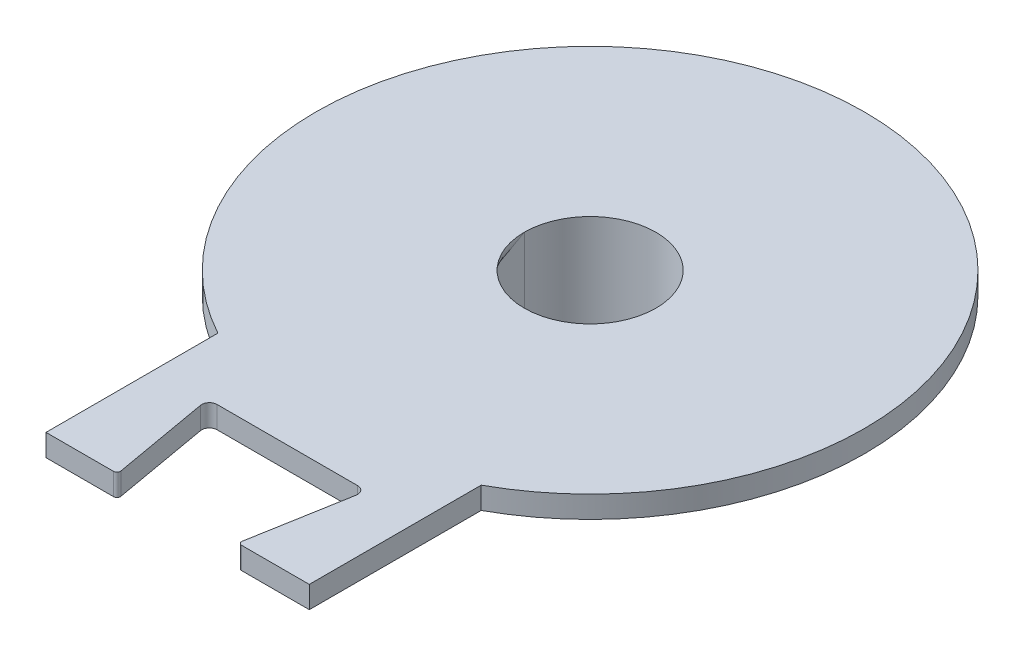
ISO-10303-21;
HEADER;
FILE_DESCRIPTION(('STEP AP214'),'2;1');
FILE_NAME('part.step','',(''),(''),'','','');
FILE_SCHEMA(('AUTOMOTIVE_DESIGN { 1 0 10303 214 1 1 1 1 }'));
ENDSEC;
DATA;
#1=APPLICATION_CONTEXT('core data for automotive mechanical design processes');
#2=APPLICATION_PROTOCOL_DEFINITION('international standard','automotive_design',2000,#1);
#3=PRODUCT_CONTEXT('',#1,'mechanical');
#4=PRODUCT('Part','Part','',(#3));
#5=PRODUCT_RELATED_PRODUCT_CATEGORY('part','',(#4));
#6=PRODUCT_DEFINITION_FORMATION('','',#4);
#7=PRODUCT_DEFINITION_CONTEXT('part definition',#1,'design');
#8=PRODUCT_DEFINITION('design','',#6,#7);
#9=PRODUCT_DEFINITION_SHAPE('','',#8);
#10=(LENGTH_UNIT() NAMED_UNIT(*) SI_UNIT(.MILLI.,.METRE.));
#11=(NAMED_UNIT(*) PLANE_ANGLE_UNIT() SI_UNIT($,.RADIAN.));
#12=(NAMED_UNIT(*) SI_UNIT($,.STERADIAN.) SOLID_ANGLE_UNIT());
#13=UNCERTAINTY_MEASURE_WITH_UNIT(LENGTH_MEASURE(1.E-05),#10,'distance_accuracy_value','');
#14=(GEOMETRIC_REPRESENTATION_CONTEXT(3) GLOBAL_UNCERTAINTY_ASSIGNED_CONTEXT((#13)) GLOBAL_UNIT_ASSIGNED_CONTEXT((#10,
#11,#12)) REPRESENTATION_CONTEXT('',''));
#15=CARTESIAN_POINT('',(0.,0.,0.));
#16=DIRECTION('',(0.,0.,1.));
#17=DIRECTION('',(1.,0.,0.));
#18=AXIS2_PLACEMENT_3D('',#15,#16,#17);
#19=CARTESIAN_POINT('',(0.,0.,0.));
#20=DIRECTION('',(0.,1.,0.));
#21=DIRECTION('',(0.,0.,1.));
#22=AXIS2_PLACEMENT_3D('',#19,#20,#21);
#23=PLANE('',#22);
#24=DIRECTION('',(-1.,0.,0.));
#25=VECTOR('',#24,1.);
#26=CARTESIAN_POINT('',(0.,0.,18.8));
#27=LINE('',#26,#25);
#28=CARTESIAN_POINT('',(6.,0.,18.8));
#29=VERTEX_POINT('',#28);
#30=CARTESIAN_POINT('',(2.91630349460621,0.,18.8));
#31=VERTEX_POINT('',#30);
#32=EDGE_CURVE('E187',#29,#31,#27,.T.);
#33=ORIENTED_EDGE('',*,*,#32,.T.);
#34=CARTESIAN_POINT('',(2.91630349460621,0.,18.65));
#35=DIRECTION('',(0.,1.,0.));
#36=DIRECTION('',(0.,0.,1.));
#37=AXIS2_PLACEMENT_3D('',#34,#35,#36);
#38=CIRCLE('',#37,0.15);
#39=CARTESIAN_POINT('',(2.76858233165438,0.,18.62395277335));
#40=VERTEX_POINT('',#39);
#41=EDGE_CURVE('E459',#31,#40,#38,.F.);
#42=ORIENTED_EDGE('',*,*,#41,.T.);
#43=DIRECTION('',(-0.173648177666934,0.,0.984807753012207));
#44=VECTOR('',#43,1.);
#45=CARTESIAN_POINT('',(2.70227505957538,0.,19.));
#46=LINE('',#45,#44);
#47=CARTESIAN_POINT('',(3.54674431540572,0.,14.2107768621834));
#48=VERTEX_POINT('',#47);
#49=EDGE_CURVE('E229',#48,#40,#46,.T.);
#50=ORIENTED_EDGE('',*,*,#49,.F.);
#51=CARTESIAN_POINT('',(3.20206160185145,0.,14.15));
#52=DIRECTION('',(0.,1.,0.));
#53=DIRECTION('',(0.,0.,1.));
#54=AXIS2_PLACEMENT_3D('',#51,#52,#53);
#55=CIRCLE('',#54,0.35);
#56=CARTESIAN_POINT('',(3.20206160185145,0.,13.8));
#57=VERTEX_POINT('',#56);
#58=EDGE_CURVE('E436',#48,#57,#55,.T.);
#59=ORIENTED_EDGE('',*,*,#58,.T.);
#60=DIRECTION('',(1.,0.,0.));
#61=VECTOR('',#60,1.);
#62=CARTESIAN_POINT('',(3.61917535925942,0.,13.8));
#63=LINE('',#62,#61);
#64=CARTESIAN_POINT('',(-3.20206160185144,0.,13.8));
#65=VERTEX_POINT('',#64);
#66=EDGE_CURVE('E226',#65,#57,#63,.T.);
#67=ORIENTED_EDGE('',*,*,#66,.F.);
#68=CARTESIAN_POINT('',(-3.20206160185145,0.,14.15));
#69=DIRECTION('',(0.,1.,0.));
#70=DIRECTION('',(0.,0.,1.));
#71=AXIS2_PLACEMENT_3D('',#68,#69,#70);
#72=CIRCLE('',#71,0.35);
#73=CARTESIAN_POINT('',(-3.54674431540572,0.,14.2107768621834));
#74=VERTEX_POINT('',#73);
#75=EDGE_CURVE('E435',#65,#74,#72,.T.);
#76=ORIENTED_EDGE('',*,*,#75,.T.);
#77=DIRECTION('',(-0.173648177666935,0.,-0.984807753012207));
#78=VECTOR('',#77,1.);
#79=CARTESIAN_POINT('',(-2.70227505957538,0.,19.));
#80=LINE('',#79,#78);
#81=CARTESIAN_POINT('',(-2.76858233165438,0.,18.62395277335));
#82=VERTEX_POINT('',#81);
#83=EDGE_CURVE('E222',#82,#74,#80,.T.);
#84=ORIENTED_EDGE('',*,*,#83,.F.);
#85=CARTESIAN_POINT('',(-2.91630349460621,0.,18.65));
#86=DIRECTION('',(0.,1.,0.));
#87=DIRECTION('',(0.,0.,1.));
#88=AXIS2_PLACEMENT_3D('',#85,#86,#87);
#89=CIRCLE('',#88,0.15);
#90=CARTESIAN_POINT('',(-2.91630349460621,0.,18.8));
#91=VERTEX_POINT('',#90);
#92=EDGE_CURVE('E58',#82,#91,#89,.F.);
#93=ORIENTED_EDGE('',*,*,#92,.T.);
#94=CARTESIAN_POINT('',(-6.,0.,18.8));
#95=VERTEX_POINT('',#94);
#96=EDGE_CURVE('E246',#91,#95,#27,.T.);
#97=ORIENTED_EDGE('',*,*,#96,.T.);
#98=DIRECTION('',(0.,0.,1.));
#99=VECTOR('',#98,1.);
#100=CARTESIAN_POINT('',(-6.,0.,13.2915026221292));
#101=LINE('',#100,#99);
#102=CARTESIAN_POINT('',(-6.,0.,10.9658560997307));
#103=VERTEX_POINT('',#102);
#104=EDGE_CURVE('E218',#103,#95,#101,.T.);
#105=ORIENTED_EDGE('',*,*,#104,.F.);
#106=CARTESIAN_POINT('',(0.,0.,0.));
#107=DIRECTION('',(0.,1.,0.));
#108=DIRECTION('',(0.,0.,1.));
#109=AXIS2_PLACEMENT_3D('',#106,#107,#108);
#110=CIRCLE('',#109,12.5);
#111=CARTESIAN_POINT('',(6.,0.,10.9658560997307));
#112=VERTEX_POINT('',#111);
#113=EDGE_CURVE('E471',#112,#103,#110,.T.);
#114=ORIENTED_EDGE('',*,*,#113,.F.);
#115=DIRECTION('',(0.,0.,-1.));
#116=VECTOR('',#115,1.);
#117=CARTESIAN_POINT('',(6.,0.,13.2915026221292));
#118=LINE('',#117,#116);
#119=EDGE_CURVE('E233',#29,#112,#118,.T.);
#120=ORIENTED_EDGE('',*,*,#119,.F.);
#121=EDGE_LOOP('',(#33,#42,#50,#59,#67,#76,#84,#93,#97,#105,#114,#120));
#122=FACE_BOUND('',#121,.T.);
#123=DIRECTION('',(0.,0.,1.));
#124=VECTOR('',#123,1.);
#125=CARTESIAN_POINT('',(-3.,0.,0.));
#126=LINE('',#125,#124);
#127=CARTESIAN_POINT('',(-3.,0.,2.64575131106459));
#128=VERTEX_POINT('',#127);
#129=CARTESIAN_POINT('',(-3.,0.,2.82842712474619));
#130=VERTEX_POINT('',#129);
#131=EDGE_CURVE('E242',#128,#130,#126,.T.);
#132=ORIENTED_EDGE('',*,*,#131,.F.);
#133=CARTESIAN_POINT('',(0.,0.,0.));
#134=DIRECTION('',(0.,1.,0.));
#135=DIRECTION('',(0.,0.,1.));
#136=AXIS2_PLACEMENT_3D('',#133,#134,#135);
#137=CIRCLE('',#136,4.);
#138=CARTESIAN_POINT('',(3.,0.,2.64575131106459));
#139=VERTEX_POINT('',#138);
#140=EDGE_CURVE('E249',#128,#139,#137,.T.);
#141=ORIENTED_EDGE('',*,*,#140,.T.);
#142=DIRECTION('',(0.,0.,-1.));
#143=VECTOR('',#142,1.);
#144=CARTESIAN_POINT('',(3.,0.,0.));
#145=LINE('',#144,#143);
#146=CARTESIAN_POINT('',(3.,0.,2.82842712474619));
#147=VERTEX_POINT('',#146);
#148=EDGE_CURVE('E368',#147,#139,#145,.T.);
#149=ORIENTED_EDGE('',*,*,#148,.F.);
#150=CARTESIAN_POINT('',(3.5,0.,2.82842712474619));
#151=DIRECTION('',(0.,1.,0.));
#152=DIRECTION('',(0.,0.,1.));
#153=AXIS2_PLACEMENT_3D('',#150,#151,#152);
#154=CIRCLE('',#153,0.5);
#155=CARTESIAN_POINT('',(3.88888888888889,0.,3.14269680527354));
#156=VERTEX_POINT('',#155);
#157=EDGE_CURVE('E341',#147,#156,#154,.T.);
#158=ORIENTED_EDGE('',*,*,#157,.T.);
#159=CARTESIAN_POINT('',(0.,0.,0.));
#160=DIRECTION('',(0.,-1.,0.));
#161=DIRECTION('',(0.,0.,-1.));
#162=AXIS2_PLACEMENT_3D('',#159,#160,#161);
#163=CIRCLE('',#162,5.);
#164=CARTESIAN_POINT('',(-3.88888888888889,0.,3.14269680527354));
#165=VERTEX_POINT('',#164);
#166=EDGE_CURVE('E245',#165,#156,#163,.T.);
#167=ORIENTED_EDGE('',*,*,#166,.F.);
#168=CARTESIAN_POINT('',(-3.5,0.,2.82842712474619));
#169=DIRECTION('',(0.,1.,0.));
#170=DIRECTION('',(0.,0.,1.));
#171=AXIS2_PLACEMENT_3D('',#168,#169,#170);
#172=CIRCLE('',#171,0.5);
#173=EDGE_CURVE('E247',#165,#130,#172,.T.);
#174=ORIENTED_EDGE('',*,*,#173,.T.);
#175=EDGE_LOOP('',(#132,#141,#149,#158,#167,#174));
#176=FACE_BOUND('',#175,.T.);
#177=ADVANCED_FACE('F39',(#122,#176),#23,.F.);
#178=CARTESIAN_POINT('',(-6.,1.,13.2915026221292));
#179=DIRECTION('',(1.,0.,0.));
#180=DIRECTION('',(0.,0.,-1.));
#181=AXIS2_PLACEMENT_3D('',#178,#179,#180);
#182=PLANE('',#181);
#183=ORIENTED_EDGE('',*,*,#104,.T.);
#184=DIRECTION('',(0.,1.,0.));
#185=VECTOR('',#184,1.);
#186=CARTESIAN_POINT('',(-6.,-3.,18.8));
#187=LINE('',#186,#185);
#188=CARTESIAN_POINT('',(-6.,1.,18.8));
#189=VERTEX_POINT('',#188);
#190=EDGE_CURVE('E192',#95,#189,#187,.T.);
#191=ORIENTED_EDGE('',*,*,#190,.T.);
#192=DIRECTION('',(0.,0.,1.));
#193=VECTOR('',#192,1.);
#194=CARTESIAN_POINT('',(-6.,1.,-6.));
#195=LINE('',#194,#193);
#196=CARTESIAN_POINT('',(-6.,1.,10.9658560997307));
#197=VERTEX_POINT('',#196);
#198=EDGE_CURVE('E235',#197,#189,#195,.T.);
#199=ORIENTED_EDGE('',*,*,#198,.F.);
#200=DIRECTION('',(0.,-1.,0.));
#201=VECTOR('',#200,1.);
#202=CARTESIAN_POINT('',(-6.,1.,10.9658560997307));
#203=LINE('',#202,#201);
#204=EDGE_CURVE('E412',#103,#197,#203,.F.);
#205=ORIENTED_EDGE('',*,*,#204,.F.);
#206=EDGE_LOOP('',(#183,#191,#199,#205));
#207=FACE_BOUND('',#206,.T.);
#208=ADVANCED_FACE('F295',(#207),#182,.F.);
#209=CARTESIAN_POINT('',(6.,1.,13.2915026221292));
#210=DIRECTION('',(-1.,0.,0.));
#211=DIRECTION('',(0.,0.,1.));
#212=AXIS2_PLACEMENT_3D('',#209,#210,#211);
#213=PLANE('',#212);
#214=DIRECTION('',(0.,0.,-1.));
#215=VECTOR('',#214,1.);
#216=CARTESIAN_POINT('',(6.,1.,19.));
#217=LINE('',#216,#215);
#218=CARTESIAN_POINT('',(6.,1.,18.8));
#219=VERTEX_POINT('',#218);
#220=CARTESIAN_POINT('',(6.,1.,10.9658560997307));
#221=VERTEX_POINT('',#220);
#222=EDGE_CURVE('E199',#219,#221,#217,.T.);
#223=ORIENTED_EDGE('',*,*,#222,.F.);
#224=DIRECTION('',(0.,1.,0.));
#225=VECTOR('',#224,1.);
#226=CARTESIAN_POINT('',(6.,-3.,18.8));
#227=LINE('',#226,#225);
#228=EDGE_CURVE('E181',#29,#219,#227,.T.);
#229=ORIENTED_EDGE('',*,*,#228,.F.);
#230=ORIENTED_EDGE('',*,*,#119,.T.);
#231=DIRECTION('',(0.,-1.,0.));
#232=VECTOR('',#231,1.);
#233=CARTESIAN_POINT('',(6.,1.,10.9658560997307));
#234=LINE('',#233,#232);
#235=EDGE_CURVE('E207',#221,#112,#234,.T.);
#236=ORIENTED_EDGE('',*,*,#235,.F.);
#237=EDGE_LOOP('',(#223,#229,#230,#236));
#238=FACE_BOUND('',#237,.T.);
#239=ADVANCED_FACE('F205',(#238),#213,.F.);
#240=CARTESIAN_POINT('',(0.,1.,0.));
#241=DIRECTION('',(0.,1.,0.));
#242=DIRECTION('',(0.,0.,1.));
#243=AXIS2_PLACEMENT_3D('',#240,#241,#242);
#244=PLANE('',#243);
#245=DIRECTION('',(-0.173648177666934,0.,0.984807753012207));
#246=VECTOR('',#245,1.);
#247=CARTESIAN_POINT('',(2.70227505957538,1.,19.));
#248=LINE('',#247,#246);
#249=CARTESIAN_POINT('',(3.54674431540572,1.,14.2107768621834));
#250=VERTEX_POINT('',#249);
#251=CARTESIAN_POINT('',(2.76858233165438,1.,18.62395277335));
#252=VERTEX_POINT('',#251);
#253=EDGE_CURVE('E209',#250,#252,#248,.T.);
#254=ORIENTED_EDGE('',*,*,#253,.T.);
#255=CARTESIAN_POINT('',(2.91630349460621,1.,18.65));
#256=DIRECTION('',(0.,1.,0.));
#257=DIRECTION('',(0.,0.,1.));
#258=AXIS2_PLACEMENT_3D('',#255,#256,#257);
#259=CIRCLE('',#258,0.15);
#260=CARTESIAN_POINT('',(2.91630349460621,1.,18.8));
#261=VERTEX_POINT('',#260);
#262=EDGE_CURVE('E201',#252,#261,#259,.T.);
#263=ORIENTED_EDGE('',*,*,#262,.T.);
#264=DIRECTION('',(-1.,0.,0.));
#265=VECTOR('',#264,1.);
#266=CARTESIAN_POINT('',(-6.,1.,18.8));
#267=LINE('',#266,#265);
#268=EDGE_CURVE('E184',#219,#261,#267,.T.);
#269=ORIENTED_EDGE('',*,*,#268,.F.);
#270=ORIENTED_EDGE('',*,*,#222,.T.);
#271=CARTESIAN_POINT('',(0.,1.,0.));
#272=DIRECTION('',(0.,1.,0.));
#273=DIRECTION('',(0.,0.,1.));
#274=AXIS2_PLACEMENT_3D('',#271,#272,#273);
#275=CIRCLE('',#274,12.5);
#276=EDGE_CURVE('E377',#221,#197,#275,.T.);
#277=ORIENTED_EDGE('',*,*,#276,.T.);
#278=ORIENTED_EDGE('',*,*,#198,.T.);
#279=CARTESIAN_POINT('',(-2.91630349460621,1.,18.8));
#280=VERTEX_POINT('',#279);
#281=EDGE_CURVE('E203',#280,#189,#267,.T.);
#282=ORIENTED_EDGE('',*,*,#281,.F.);
#283=CARTESIAN_POINT('',(-2.91630349460621,1.,18.65));
#284=DIRECTION('',(0.,1.,0.));
#285=DIRECTION('',(0.,0.,1.));
#286=AXIS2_PLACEMENT_3D('',#283,#284,#285);
#287=CIRCLE('',#286,0.15);
#288=CARTESIAN_POINT('',(-2.76858233165438,1.,18.62395277335));
#289=VERTEX_POINT('',#288);
#290=EDGE_CURVE('E449',#280,#289,#287,.T.);
#291=ORIENTED_EDGE('',*,*,#290,.T.);
#292=DIRECTION('',(-0.173648177666935,0.,-0.984807753012207));
#293=VECTOR('',#292,1.);
#294=CARTESIAN_POINT('',(-2.70227505957538,1.,19.));
#295=LINE('',#294,#293);
#296=CARTESIAN_POINT('',(-3.54674431540572,1.,14.2107768621834));
#297=VERTEX_POINT('',#296);
#298=EDGE_CURVE('E419',#289,#297,#295,.T.);
#299=ORIENTED_EDGE('',*,*,#298,.T.);
#300=CARTESIAN_POINT('',(-3.20206160185145,1.,14.15));
#301=DIRECTION('',(0.,1.,0.));
#302=DIRECTION('',(0.,0.,1.));
#303=AXIS2_PLACEMENT_3D('',#300,#301,#302);
#304=CIRCLE('',#303,0.35);
#305=CARTESIAN_POINT('',(-3.20206160185145,1.,13.8));
#306=VERTEX_POINT('',#305);
#307=EDGE_CURVE('E427',#297,#306,#304,.F.);
#308=ORIENTED_EDGE('',*,*,#307,.T.);
#309=DIRECTION('',(1.,0.,0.));
#310=VECTOR('',#309,1.);
#311=CARTESIAN_POINT('',(-3.61917535925942,1.,13.8));
#312=LINE('',#311,#310);
#313=CARTESIAN_POINT('',(3.20206160185144,1.,13.8));
#314=VERTEX_POINT('',#313);
#315=EDGE_CURVE('E214',#306,#314,#312,.T.);
#316=ORIENTED_EDGE('',*,*,#315,.T.);
#317=CARTESIAN_POINT('',(3.20206160185145,1.,14.15));
#318=DIRECTION('',(0.,1.,0.));
#319=DIRECTION('',(0.,0.,1.));
#320=AXIS2_PLACEMENT_3D('',#317,#318,#319);
#321=CIRCLE('',#320,0.35);
#322=EDGE_CURVE('E424',#314,#250,#321,.F.);
#323=ORIENTED_EDGE('',*,*,#322,.T.);
#324=EDGE_LOOP('',(#254,#263,#269,#270,#277,#278,#282,#291,#299,#308,#316,#323));
#325=FACE_BOUND('',#324,.T.);
#326=CARTESIAN_POINT('',(0.,1.,0.));
#327=DIRECTION('',(0.,1.,0.));
#328=DIRECTION('',(0.,0.,1.));
#329=AXIS2_PLACEMENT_3D('',#326,#327,#328);
#330=CIRCLE('',#329,3.);
#331=CARTESIAN_POINT('',(3.,1.,0.));
#332=VERTEX_POINT('',#331);
#333=CARTESIAN_POINT('',(-3.,1.,0.));
#334=VERTEX_POINT('',#333);
#335=EDGE_CURVE('E223',#332,#334,#330,.T.);
#336=ORIENTED_EDGE('',*,*,#335,.F.);
#337=EDGE_CURVE('E410',#334,#332,#330,.T.);
#338=ORIENTED_EDGE('',*,*,#337,.F.);
#339=EDGE_LOOP('',(#336,#338));
#340=FACE_BOUND('',#339,.T.);
#341=ADVANCED_FACE('F196',(#325,#340),#244,.T.);
#342=CARTESIAN_POINT('',(-2.70227505957538,1.,19.));
#343=DIRECTION('',(-0.984807753012207,0.,0.173648177666935));
#344=DIRECTION('',(0.173648177666935,0.,0.984807753012207));
#345=AXIS2_PLACEMENT_3D('',#342,#343,#344);
#346=PLANE('',#345);
#347=ORIENTED_EDGE('',*,*,#298,.F.);
#348=DIRECTION('',(0.,-1.,0.));
#349=VECTOR('',#348,1.);
#350=CARTESIAN_POINT('',(-2.76858233165438,1.,18.62395277335));
#351=LINE('',#350,#349);
#352=EDGE_CURVE('E48',#289,#82,#351,.T.);
#353=ORIENTED_EDGE('',*,*,#352,.T.);
#354=ORIENTED_EDGE('',*,*,#83,.T.);
#355=DIRECTION('',(0.,-1.,0.));
#356=VECTOR('',#355,1.);
#357=CARTESIAN_POINT('',(-3.54674431540572,1.,14.2107768621834));
#358=LINE('',#357,#356);
#359=EDGE_CURVE('E440',#74,#297,#358,.F.);
#360=ORIENTED_EDGE('',*,*,#359,.T.);
#361=EDGE_LOOP('',(#347,#353,#354,#360));
#362=FACE_BOUND('',#361,.T.);
#363=ADVANCED_FACE('F316',(#362),#346,.F.);
#364=CARTESIAN_POINT('',(3.61917535925942,1.,13.8));
#365=DIRECTION('',(0.,0.,-1.));
#366=DIRECTION('',(-1.,0.,0.));
#367=AXIS2_PLACEMENT_3D('',#364,#365,#366);
#368=PLANE('',#367);
#369=ORIENTED_EDGE('',*,*,#66,.T.);
#370=DIRECTION('',(0.,-1.,0.));
#371=VECTOR('',#370,1.);
#372=CARTESIAN_POINT('',(3.20206160185145,1.,13.8));
#373=LINE('',#372,#371);
#374=EDGE_CURVE('E432',#57,#314,#373,.F.);
#375=ORIENTED_EDGE('',*,*,#374,.T.);
#376=ORIENTED_EDGE('',*,*,#315,.F.);
#377=DIRECTION('',(0.,-1.,0.));
#378=VECTOR('',#377,1.);
#379=CARTESIAN_POINT('',(-3.20206160185145,0.,13.8));
#380=LINE('',#379,#378);
#381=EDGE_CURVE('E467',#306,#65,#380,.T.);
#382=ORIENTED_EDGE('',*,*,#381,.T.);
#383=EDGE_LOOP('',(#369,#375,#376,#382));
#384=FACE_BOUND('',#383,.T.);
#385=ADVANCED_FACE('F312',(#384),#368,.F.);
#386=CARTESIAN_POINT('',(2.70227505957538,1.,19.));
#387=DIRECTION('',(0.984807753012207,0.,0.173648177666934));
#388=DIRECTION('',(0.173648177666934,0.,-0.984807753012207));
#389=AXIS2_PLACEMENT_3D('',#386,#387,#388);
#390=PLANE('',#389);
#391=ORIENTED_EDGE('',*,*,#49,.T.);
#392=DIRECTION('',(0.,1.,0.));
#393=VECTOR('',#392,1.);
#394=CARTESIAN_POINT('',(2.76858233165438,1.,18.62395277335));
#395=LINE('',#394,#393);
#396=EDGE_CURVE('E445',#40,#252,#395,.T.);
#397=ORIENTED_EDGE('',*,*,#396,.T.);
#398=ORIENTED_EDGE('',*,*,#253,.F.);
#399=DIRECTION('',(0.,-1.,0.));
#400=VECTOR('',#399,1.);
#401=CARTESIAN_POINT('',(3.54674431540572,0.,14.2107768621834));
#402=LINE('',#401,#400);
#403=EDGE_CURVE('E434',#250,#48,#402,.T.);
#404=ORIENTED_EDGE('',*,*,#403,.T.);
#405=EDGE_LOOP('',(#391,#397,#398,#404));
#406=FACE_BOUND('',#405,.T.);
#407=ADVANCED_FACE('F308',(#406),#390,.F.);
#408=CARTESIAN_POINT('',(0.,1.,0.));
#409=DIRECTION('',(0.,-1.,0.));
#410=DIRECTION('',(0.,0.,-1.));
#411=AXIS2_PLACEMENT_3D('',#408,#409,#410);
#412=CYLINDRICAL_SURFACE('',#411,3.);
#413=DIRECTION('',(0.,1.,0.));
#414=VECTOR('',#413,1.);
#415=CARTESIAN_POINT('',(3.,-4.,0.));
#416=LINE('',#415,#414);
#417=CARTESIAN_POINT('',(3.,-4.,0.));
#418=VERTEX_POINT('',#417);
#419=EDGE_CURVE('E373',#418,#332,#416,.T.);
#420=ORIENTED_EDGE('',*,*,#419,.T.);
#421=ORIENTED_EDGE('',*,*,#335,.T.);
#422=DIRECTION('',(0.,1.,0.));
#423=VECTOR('',#422,1.);
#424=CARTESIAN_POINT('',(-3.,-4.,0.));
#425=LINE('',#424,#423);
#426=CARTESIAN_POINT('',(-3.,-4.,0.));
#427=VERTEX_POINT('',#426);
#428=EDGE_CURVE('E239',#427,#334,#425,.T.);
#429=ORIENTED_EDGE('',*,*,#428,.F.);
#430=CARTESIAN_POINT('',(0.,-4.,0.));
#431=DIRECTION('',(0.,1.,0.));
#432=DIRECTION('',(0.,0.,-1.));
#433=AXIS2_PLACEMENT_3D('',#430,#431,#432);
#434=CIRCLE('',#433,3.);
#435=EDGE_CURVE('E362',#418,#427,#434,.T.);
#436=ORIENTED_EDGE('',*,*,#435,.F.);
#437=EDGE_LOOP('',(#420,#421,#429,#436));
#438=FACE_BOUND('',#437,.T.);
#439=ADVANCED_FACE('F311',(#438),#412,.F.);
#440=CARTESIAN_POINT('',(0.,1.,0.));
#441=DIRECTION('',(0.,-1.,0.));
#442=DIRECTION('',(0.,0.,-1.));
#443=AXIS2_PLACEMENT_3D('',#440,#441,#442);
#444=CYLINDRICAL_SURFACE('',#443,12.5);
#445=ORIENTED_EDGE('',*,*,#113,.T.);
#446=ORIENTED_EDGE('',*,*,#204,.T.);
#447=ORIENTED_EDGE('',*,*,#276,.F.);
#448=ORIENTED_EDGE('',*,*,#235,.T.);
#449=EDGE_LOOP('',(#445,#446,#447,#448));
#450=FACE_BOUND('',#449,.T.);
#451=ADVANCED_FACE('F395',(#450),#444,.T.);
#452=CARTESIAN_POINT('',(-3.,-4.,0.));
#453=DIRECTION('',(-1.,0.,0.));
#454=DIRECTION('',(0.,0.,1.));
#455=AXIS2_PLACEMENT_3D('',#452,#453,#454);
#456=PLANE('',#455);
#457=ORIENTED_EDGE('',*,*,#428,.T.);
#458=CARTESIAN_POINT('',(-3.,0.,2.64575131106459));
#459=CARTESIAN_POINT('',(-3.,1.94305538130157E-05,2.57016194483119));
#460=CARTESIAN_POINT('',(-3.,0.00374525929692821,2.49467524016356));
#461=CARTESIAN_POINT('',(-3.,0.0176487203171327,2.34444808680621));
#462=CARTESIAN_POINT('',(-3.,0.0278125407328459,2.26970638761701));
#463=CARTESIAN_POINT('',(-3.,0.0661773169838116,2.04907996191367));
#464=CARTESIAN_POINT('',(-3.,0.102309557114224,1.90458087283219));
#465=CARTESIAN_POINT('',(-3.,0.19397177417641,1.60774203412234));
#466=CARTESIAN_POINT('',(-3.,0.250961869138112,1.45587697914278));
#467=CARTESIAN_POINT('',(-3.,0.377460066123741,1.15738942520922));
#468=CARTESIAN_POINT('',(-3.,0.446982508961536,1.01077316527978));
#469=CARTESIAN_POINT('',(-3.,0.668046378842599,0.575079600097701));
#470=CARTESIAN_POINT('',(-3.,0.831329239189772,0.292147629615747));
#471=CARTESIAN_POINT('',(-3.,0.996348548471457,0.00632453296491798));
#472=CARTESIAN_POINT('',(-3.,0.998174290801066,0.00316225503354001));
#473=CARTESIAN_POINT('',(-3.,1.,0.));
#474=B_SPLINE_CURVE_WITH_KNOTS('',3,(#458,#459,#460,#461,#462,#463,#464,#465,#466,#467,#468,
#469,#470,#471,#472,#473),.UNSPECIFIED.,.F.,.F.,(4,2,2,2,2,2,2,4),(0.,0.226523097183252,
0.45256185735686,0.898071970071577,1.38391997806568,1.87032751436427,2.84948260162627,
2.86043705277646),.UNSPECIFIED.);
#475=EDGE_CURVE('E260',#334,#128,#474,.F.);
#476=ORIENTED_EDGE('',*,*,#475,.T.);
#477=ORIENTED_EDGE('',*,*,#131,.T.);
#478=DIRECTION('',(0.,1.,0.));
#479=VECTOR('',#478,1.);
#480=CARTESIAN_POINT('',(-3.,-4.,2.82842712474619));
#481=LINE('',#480,#479);
#482=CARTESIAN_POINT('',(-3.,-4.,2.82842712474619));
#483=VERTEX_POINT('',#482);
#484=EDGE_CURVE('E338',#130,#483,#481,.F.);
#485=ORIENTED_EDGE('',*,*,#484,.T.);
#486=DIRECTION('',(0.,0.,1.));
#487=VECTOR('',#486,1.);
#488=CARTESIAN_POINT('',(-3.,-4.,0.));
#489=LINE('',#488,#487);
#490=EDGE_CURVE('E358',#427,#483,#489,.T.);
#491=ORIENTED_EDGE('',*,*,#490,.F.);
#492=EDGE_LOOP('',(#457,#476,#477,#485,#491));
#493=FACE_BOUND('',#492,.T.);
#494=ADVANCED_FACE('F357',(#493),#456,.F.);
#495=CARTESIAN_POINT('',(0.,-4.,0.));
#496=DIRECTION('',(0.,1.,0.));
#497=DIRECTION('',(0.,0.,1.));
#498=AXIS2_PLACEMENT_3D('',#495,#496,#497);
#499=CYLINDRICAL_SURFACE('',#498,5.);
#500=ORIENTED_EDGE('',*,*,#166,.T.);
#501=DIRECTION('',(0.,1.,0.));
#502=VECTOR('',#501,1.);
#503=CARTESIAN_POINT('',(3.88888888888889,-4.,3.14269680527354));
#504=LINE('',#503,#502);
#505=CARTESIAN_POINT('',(3.88888888888889,-4.,3.14269680527354));
#506=VERTEX_POINT('',#505);
#507=EDGE_CURVE('E334',#156,#506,#504,.F.);
#508=ORIENTED_EDGE('',*,*,#507,.T.);
#509=CARTESIAN_POINT('',(0.,-4.,0.));
#510=DIRECTION('',(0.,-1.,0.));
#511=DIRECTION('',(0.,0.,-1.));
#512=AXIS2_PLACEMENT_3D('',#509,#510,#511);
#513=CIRCLE('',#512,5.);
#514=CARTESIAN_POINT('',(-3.88888888888889,-4.,3.14269680527354));
#515=VERTEX_POINT('',#514);
#516=EDGE_CURVE('E364',#515,#506,#513,.T.);
#517=ORIENTED_EDGE('',*,*,#516,.F.);
#518=DIRECTION('',(0.,1.,0.));
#519=VECTOR('',#518,1.);
#520=CARTESIAN_POINT('',(-3.88888888888889,-4.,3.14269680527354));
#521=LINE('',#520,#519);
#522=EDGE_CURVE('E386',#515,#165,#521,.T.);
#523=ORIENTED_EDGE('',*,*,#522,.T.);
#524=EDGE_LOOP('',(#500,#508,#517,#523));
#525=FACE_BOUND('',#524,.T.);
#526=ADVANCED_FACE('F388',(#525),#499,.T.);
#527=CARTESIAN_POINT('',(3.,-4.,0.));
#528=DIRECTION('',(1.,0.,0.));
#529=DIRECTION('',(0.,0.,-1.));
#530=AXIS2_PLACEMENT_3D('',#527,#528,#529);
#531=PLANE('',#530);
#532=DIRECTION('',(0.,0.,-1.));
#533=VECTOR('',#532,1.);
#534=CARTESIAN_POINT('',(3.,-4.,0.));
#535=LINE('',#534,#533);
#536=CARTESIAN_POINT('',(3.,-4.,2.82842712474619));
#537=VERTEX_POINT('',#536);
#538=EDGE_CURVE('E366',#537,#418,#535,.T.);
#539=ORIENTED_EDGE('',*,*,#538,.F.);
#540=DIRECTION('',(0.,1.,0.));
#541=VECTOR('',#540,1.);
#542=CARTESIAN_POINT('',(3.,-4.,2.82842712474619));
#543=LINE('',#542,#541);
#544=EDGE_CURVE('E211',#537,#147,#543,.T.);
#545=ORIENTED_EDGE('',*,*,#544,.T.);
#546=ORIENTED_EDGE('',*,*,#148,.T.);
#547=CARTESIAN_POINT('',(3.,0.,2.64575131106459));
#548=CARTESIAN_POINT('',(3.,1.94305538130157E-05,2.57016194483119));
#549=CARTESIAN_POINT('',(3.,0.00374525929692821,2.49467524016356));
#550=CARTESIAN_POINT('',(3.,0.0176487203171327,2.34444808680621));
#551=CARTESIAN_POINT('',(3.,0.0278125407328459,2.26970638761701));
#552=CARTESIAN_POINT('',(3.,0.0661773169838116,2.04907996191367));
#553=CARTESIAN_POINT('',(3.,0.102309557114224,1.90458087283219));
#554=CARTESIAN_POINT('',(3.,0.19397177417641,1.60774203412234));
#555=CARTESIAN_POINT('',(3.,0.250961869138112,1.45587697914278));
#556=CARTESIAN_POINT('',(3.,0.377460066123741,1.15738942520922));
#557=CARTESIAN_POINT('',(3.,0.446982508961536,1.01077316527978));
#558=CARTESIAN_POINT('',(3.,0.668046378842599,0.575079600097701));
#559=CARTESIAN_POINT('',(3.,0.831329239189772,0.292147629615747));
#560=CARTESIAN_POINT('',(3.,0.996348548471457,0.00632453296491798));
#561=CARTESIAN_POINT('',(3.,0.998174290801066,0.00316225503354001));
#562=CARTESIAN_POINT('',(3.,1.,0.));
#563=B_SPLINE_CURVE_WITH_KNOTS('',3,(#547,#548,#549,#550,#551,#552,#553,#554,#555,#556,#557,
#558,#559,#560,#561,#562),.UNSPECIFIED.,.F.,.F.,(4,2,2,2,2,2,2,4),(0.,0.226523097183252,
0.45256185735686,0.898071970071577,1.38391997806568,1.87032751436427,2.84948260162627,
2.86043705277646),.UNSPECIFIED.);
#564=EDGE_CURVE('E252',#139,#332,#563,.T.);
#565=ORIENTED_EDGE('',*,*,#564,.T.);
#566=ORIENTED_EDGE('',*,*,#419,.F.);
#567=EDGE_LOOP('',(#539,#545,#546,#565,#566));
#568=FACE_BOUND('',#567,.T.);
#569=ADVANCED_FACE('F266',(#568),#531,.F.);
#570=CARTESIAN_POINT('',(0.,-4.,0.));
#571=DIRECTION('',(0.,-1.,0.));
#572=DIRECTION('',(0.,0.,-1.));
#573=AXIS2_PLACEMENT_3D('',#570,#571,#572);
#574=PLANE('',#573);
#575=ORIENTED_EDGE('',*,*,#516,.T.);
#576=CARTESIAN_POINT('',(3.5,-4.,2.82842712474619));
#577=DIRECTION('',(0.,-1.,0.));
#578=DIRECTION('',(0.,0.,-1.));
#579=AXIS2_PLACEMENT_3D('',#576,#577,#578);
#580=CIRCLE('',#579,0.5);
#581=EDGE_CURVE('E333',#506,#537,#580,.T.);
#582=ORIENTED_EDGE('',*,*,#581,.T.);
#583=ORIENTED_EDGE('',*,*,#538,.T.);
#584=ORIENTED_EDGE('',*,*,#435,.T.);
#585=ORIENTED_EDGE('',*,*,#490,.T.);
#586=CARTESIAN_POINT('',(-3.5,-4.,2.82842712474619));
#587=DIRECTION('',(0.,-1.,0.));
#588=DIRECTION('',(0.,0.,-1.));
#589=AXIS2_PLACEMENT_3D('',#586,#587,#588);
#590=CIRCLE('',#589,0.5);
#591=EDGE_CURVE('E339',#483,#515,#590,.T.);
#592=ORIENTED_EDGE('',*,*,#591,.T.);
#593=EDGE_LOOP('',(#575,#582,#583,#584,#585,#592));
#594=FACE_BOUND('',#593,.T.);
#595=ADVANCED_FACE('F322',(#594),#574,.T.);
#596=CARTESIAN_POINT('',(3.5,-4.,2.82842712474619));
#597=DIRECTION('',(0.,1.,0.));
#598=DIRECTION('',(0.,0.,1.));
#599=AXIS2_PLACEMENT_3D('',#596,#597,#598);
#600=CYLINDRICAL_SURFACE('',#599,0.5);
#601=ORIENTED_EDGE('',*,*,#581,.F.);
#602=ORIENTED_EDGE('',*,*,#507,.F.);
#603=ORIENTED_EDGE('',*,*,#157,.F.);
#604=ORIENTED_EDGE('',*,*,#544,.F.);
#605=EDGE_LOOP('',(#601,#602,#603,#604));
#606=FACE_BOUND('',#605,.T.);
#607=ADVANCED_FACE('F320',(#606),#600,.T.);
#608=CARTESIAN_POINT('',(-3.5,-4.,2.82842712474619));
#609=DIRECTION('',(0.,1.,0.));
#610=DIRECTION('',(0.,0.,1.));
#611=AXIS2_PLACEMENT_3D('',#608,#609,#610);
#612=CYLINDRICAL_SURFACE('',#611,0.5);
#613=ORIENTED_EDGE('',*,*,#591,.F.);
#614=ORIENTED_EDGE('',*,*,#484,.F.);
#615=ORIENTED_EDGE('',*,*,#173,.F.);
#616=ORIENTED_EDGE('',*,*,#522,.F.);
#617=EDGE_LOOP('',(#613,#614,#615,#616));
#618=FACE_BOUND('',#617,.T.);
#619=ADVANCED_FACE('F275',(#618),#612,.T.);
#620=CARTESIAN_POINT('',(0.,1.,0.));
#621=DIRECTION('',(0.,1.,0.));
#622=DIRECTION('',(0.,0.,1.));
#623=AXIS2_PLACEMENT_3D('',#620,#621,#622);
#624=TOROIDAL_SURFACE('',#623,4.,1.);
#625=ORIENTED_EDGE('',*,*,#475,.F.);
#626=ORIENTED_EDGE('',*,*,#337,.T.);
#627=ORIENTED_EDGE('',*,*,#564,.F.);
#628=ORIENTED_EDGE('',*,*,#140,.F.);
#629=EDGE_LOOP('',(#625,#626,#627,#628));
#630=FACE_BOUND('',#629,.T.);
#631=ADVANCED_FACE('F270',(#630),#624,.T.);
#632=CARTESIAN_POINT('',(-6.,-3.,18.8));
#633=DIRECTION('',(0.,0.,-1.));
#634=DIRECTION('',(-1.,0.,0.));
#635=AXIS2_PLACEMENT_3D('',#632,#633,#634);
#636=PLANE('',#635);
#637=ORIENTED_EDGE('',*,*,#268,.T.);
#638=DIRECTION('',(0.,1.,0.));
#639=VECTOR('',#638,1.);
#640=CARTESIAN_POINT('',(2.91630349460621,-3.,18.8));
#641=LINE('',#640,#639);
#642=EDGE_CURVE('E454',#261,#31,#641,.F.);
#643=ORIENTED_EDGE('',*,*,#642,.T.);
#644=ORIENTED_EDGE('',*,*,#32,.F.);
#645=ORIENTED_EDGE('',*,*,#228,.T.);
#646=EDGE_LOOP('',(#637,#643,#644,#645));
#647=FACE_BOUND('',#646,.T.);
#648=ADVANCED_FACE('F183',(#647),#636,.F.);
#649=ORIENTED_EDGE('',*,*,#96,.F.);
#650=DIRECTION('',(0.,-1.,0.));
#651=VECTOR('',#650,1.);
#652=CARTESIAN_POINT('',(-2.91630349460621,-3.,18.8));
#653=LINE('',#652,#651);
#654=EDGE_CURVE('E11',#91,#280,#653,.F.);
#655=ORIENTED_EDGE('',*,*,#654,.T.);
#656=ORIENTED_EDGE('',*,*,#281,.T.);
#657=ORIENTED_EDGE('',*,*,#190,.F.);
#658=EDGE_LOOP('',(#649,#655,#656,#657));
#659=FACE_BOUND('',#658,.T.);
#660=ADVANCED_FACE('F283',(#659),#636,.F.);
#661=CARTESIAN_POINT('',(3.20206160185145,1.,14.15));
#662=DIRECTION('',(0.,1.,0.));
#663=DIRECTION('',(0.,0.,1.));
#664=AXIS2_PLACEMENT_3D('',#661,#662,#663);
#665=CYLINDRICAL_SURFACE('',#664,0.35);
#666=ORIENTED_EDGE('',*,*,#322,.F.);
#667=ORIENTED_EDGE('',*,*,#374,.F.);
#668=ORIENTED_EDGE('',*,*,#58,.F.);
#669=ORIENTED_EDGE('',*,*,#403,.F.);
#670=EDGE_LOOP('',(#666,#667,#668,#669));
#671=FACE_BOUND('',#670,.T.);
#672=ADVANCED_FACE('F278',(#671),#665,.F.);
#673=CARTESIAN_POINT('',(-3.20206160185145,1.,14.15));
#674=DIRECTION('',(0.,1.,0.));
#675=DIRECTION('',(0.,0.,1.));
#676=AXIS2_PLACEMENT_3D('',#673,#674,#675);
#677=CYLINDRICAL_SURFACE('',#676,0.35);
#678=ORIENTED_EDGE('',*,*,#307,.F.);
#679=ORIENTED_EDGE('',*,*,#359,.F.);
#680=ORIENTED_EDGE('',*,*,#75,.F.);
#681=ORIENTED_EDGE('',*,*,#381,.F.);
#682=EDGE_LOOP('',(#678,#679,#680,#681));
#683=FACE_BOUND('',#682,.T.);
#684=ADVANCED_FACE('F282',(#683),#677,.F.);
#685=CARTESIAN_POINT('',(2.91630349460621,1.,18.65));
#686=DIRECTION('',(0.,1.,0.));
#687=DIRECTION('',(0.,0.,1.));
#688=AXIS2_PLACEMENT_3D('',#685,#686,#687);
#689=CYLINDRICAL_SURFACE('',#688,0.15);
#690=ORIENTED_EDGE('',*,*,#41,.F.);
#691=ORIENTED_EDGE('',*,*,#642,.F.);
#692=ORIENTED_EDGE('',*,*,#262,.F.);
#693=ORIENTED_EDGE('',*,*,#396,.F.);
#694=EDGE_LOOP('',(#690,#691,#692,#693));
#695=FACE_BOUND('',#694,.T.);
#696=ADVANCED_FACE('F286',(#695),#689,.T.);
#697=CARTESIAN_POINT('',(-2.91630349460621,1.,18.65));
#698=DIRECTION('',(0.,-1.,0.));
#699=DIRECTION('',(0.,0.,-1.));
#700=AXIS2_PLACEMENT_3D('',#697,#698,#699);
#701=CYLINDRICAL_SURFACE('',#700,0.15);
#702=ORIENTED_EDGE('',*,*,#290,.F.);
#703=ORIENTED_EDGE('',*,*,#654,.F.);
#704=ORIENTED_EDGE('',*,*,#92,.F.);
#705=ORIENTED_EDGE('',*,*,#352,.F.);
#706=EDGE_LOOP('',(#702,#703,#704,#705));
#707=FACE_BOUND('',#706,.T.);
#708=ADVANCED_FACE('F41',(#707),#701,.T.);
#709=CLOSED_SHELL('',(#177,#208,#239,#341,#363,#385,#407,#439,#451,#494,#526,#569,#595,#607,
#619,#631,#648,#660,#672,#684,#696,#708));
#710=MANIFOLD_SOLID_BREP('B2',#709);
#711=ADVANCED_BREP_SHAPE_REPRESENTATION('',(#18,#710),#14);
#712=SHAPE_DEFINITION_REPRESENTATION(#9,#711);
ENDSEC;
END-ISO-10303-21;
